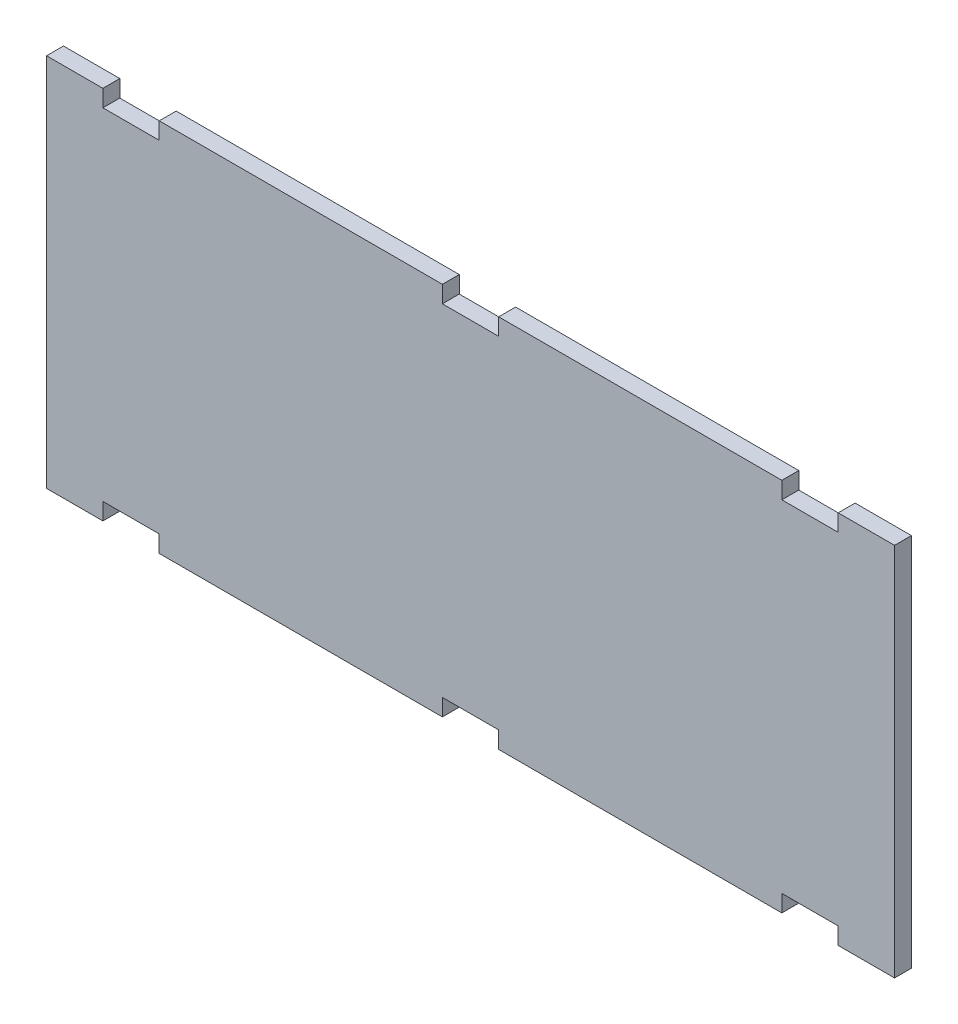
ISO-10303-21;
HEADER;
FILE_DESCRIPTION(('STEP AP214'),'2;1');
FILE_NAME('part.step','',(''),(''),'','','');
FILE_SCHEMA(('AUTOMOTIVE_DESIGN { 1 0 10303 214 1 1 1 1 }'));
ENDSEC;
DATA;
#1=APPLICATION_CONTEXT('core data for automotive mechanical design processes');
#2=APPLICATION_PROTOCOL_DEFINITION('international standard','automotive_design',2000,#1);
#3=PRODUCT_CONTEXT('',#1,'mechanical');
#4=PRODUCT('Part','Part','',(#3));
#5=PRODUCT_RELATED_PRODUCT_CATEGORY('part','',(#4));
#6=PRODUCT_DEFINITION_FORMATION('','',#4);
#7=PRODUCT_DEFINITION_CONTEXT('part definition',#1,'design');
#8=PRODUCT_DEFINITION('design','',#6,#7);
#9=PRODUCT_DEFINITION_SHAPE('','',#8);
#10=(LENGTH_UNIT() NAMED_UNIT(*) SI_UNIT(.MILLI.,.METRE.));
#11=(NAMED_UNIT(*) PLANE_ANGLE_UNIT() SI_UNIT($,.RADIAN.));
#12=(NAMED_UNIT(*) SI_UNIT($,.STERADIAN.) SOLID_ANGLE_UNIT());
#13=UNCERTAINTY_MEASURE_WITH_UNIT(LENGTH_MEASURE(1.E-05),#10,'distance_accuracy_value','');
#14=(GEOMETRIC_REPRESENTATION_CONTEXT(3) GLOBAL_UNCERTAINTY_ASSIGNED_CONTEXT((#13)) GLOBAL_UNIT_ASSIGNED_CONTEXT((#10,
#11,#12)) REPRESENTATION_CONTEXT('',''));
#15=CARTESIAN_POINT('',(0.,0.,0.));
#16=DIRECTION('',(0.,0.,1.));
#17=DIRECTION('',(1.,0.,0.));
#18=AXIS2_PLACEMENT_3D('',#15,#16,#17);
#19=CARTESIAN_POINT('',(0.,0.,6.));
#20=DIRECTION('',(0.,1.,0.));
#21=DIRECTION('',(0.,0.,1.));
#22=AXIS2_PLACEMENT_3D('',#19,#20,#21);
#23=PLANE('',#22);
#24=DIRECTION('',(1.,0.,0.));
#25=VECTOR('',#24,1.);
#26=CARTESIAN_POINT('',(0.,0.,0.));
#27=LINE('',#26,#25);
#28=CARTESIAN_POINT('',(-20.,0.,0.));
#29=VERTEX_POINT('',#28);
#30=CARTESIAN_POINT('',(0.,0.,0.));
#31=VERTEX_POINT('',#30);
#32=EDGE_CURVE('E249',#29,#31,#27,.T.);
#33=ORIENTED_EDGE('',*,*,#32,.T.);
#34=DIRECTION('',(0.,0.,-1.));
#35=VECTOR('',#34,1.);
#36=CARTESIAN_POINT('',(0.,0.,6.));
#37=LINE('',#36,#35);
#38=CARTESIAN_POINT('',(0.,0.,6.));
#39=VERTEX_POINT('',#38);
#40=EDGE_CURVE('E11',#39,#31,#37,.T.);
#41=ORIENTED_EDGE('',*,*,#40,.F.);
#42=DIRECTION('',(1.,0.,0.));
#43=VECTOR('',#42,1.);
#44=CARTESIAN_POINT('',(0.,0.,6.));
#45=LINE('',#44,#43);
#46=CARTESIAN_POINT('',(-20.,0.,6.));
#47=VERTEX_POINT('',#46);
#48=EDGE_CURVE('E303',#47,#39,#45,.T.);
#49=ORIENTED_EDGE('',*,*,#48,.F.);
#50=DIRECTION('',(0.,0.,-1.));
#51=VECTOR('',#50,1.);
#52=CARTESIAN_POINT('',(-20.,0.,6.));
#53=LINE('',#52,#51);
#54=EDGE_CURVE('E245',#47,#29,#53,.T.);
#55=ORIENTED_EDGE('',*,*,#54,.T.);
#56=EDGE_LOOP('',(#33,#41,#49,#55));
#57=FACE_BOUND('',#56,.T.);
#58=ADVANCED_FACE('F33',(#57),#23,.F.);
#59=CARTESIAN_POINT('',(0.,0.,6.));
#60=DIRECTION('',(-1.,0.,0.));
#61=DIRECTION('',(0.,0.,1.));
#62=AXIS2_PLACEMENT_3D('',#59,#60,#61);
#63=PLANE('',#62);
#64=DIRECTION('',(0.,1.,0.));
#65=VECTOR('',#64,1.);
#66=CARTESIAN_POINT('',(0.,0.,0.));
#67=LINE('',#66,#65);
#68=CARTESIAN_POINT('',(0.,133.,0.));
#69=VERTEX_POINT('',#68);
#70=EDGE_CURVE('E252',#31,#69,#67,.T.);
#71=ORIENTED_EDGE('',*,*,#70,.T.);
#72=DIRECTION('',(0.,0.,-1.));
#73=VECTOR('',#72,1.);
#74=CARTESIAN_POINT('',(0.,133.,6.));
#75=LINE('',#74,#73);
#76=CARTESIAN_POINT('',(0.,133.,6.));
#77=VERTEX_POINT('',#76);
#78=EDGE_CURVE('E41',#77,#69,#75,.T.);
#79=ORIENTED_EDGE('',*,*,#78,.F.);
#80=DIRECTION('',(0.,1.,0.));
#81=VECTOR('',#80,1.);
#82=CARTESIAN_POINT('',(0.,0.,6.));
#83=LINE('',#82,#81);
#84=EDGE_CURVE('E152',#39,#77,#83,.T.);
#85=ORIENTED_EDGE('',*,*,#84,.F.);
#86=ORIENTED_EDGE('',*,*,#40,.T.);
#87=EDGE_LOOP('',(#71,#79,#85,#86));
#88=FACE_BOUND('',#87,.T.);
#89=ADVANCED_FACE('F461',(#88),#63,.F.);
#90=CARTESIAN_POINT('',(0.,133.,6.));
#91=DIRECTION('',(0.,-1.,0.));
#92=DIRECTION('',(0.,0.,-1.));
#93=AXIS2_PLACEMENT_3D('',#90,#91,#92);
#94=PLANE('',#93);
#95=DIRECTION('',(-1.,0.,0.));
#96=VECTOR('',#95,1.);
#97=CARTESIAN_POINT('',(0.,133.,0.));
#98=LINE('',#97,#96);
#99=CARTESIAN_POINT('',(-20.,133.,0.));
#100=VERTEX_POINT('',#99);
#101=EDGE_CURVE('E254',#69,#100,#98,.T.);
#102=ORIENTED_EDGE('',*,*,#101,.T.);
#103=DIRECTION('',(0.,0.,-1.));
#104=VECTOR('',#103,1.);
#105=CARTESIAN_POINT('',(-20.,133.,6.));
#106=LINE('',#105,#104);
#107=CARTESIAN_POINT('',(-20.,133.,6.));
#108=VERTEX_POINT('',#107);
#109=EDGE_CURVE('E370',#108,#100,#106,.T.);
#110=ORIENTED_EDGE('',*,*,#109,.F.);
#111=DIRECTION('',(-1.,0.,0.));
#112=VECTOR('',#111,1.);
#113=CARTESIAN_POINT('',(0.,133.,6.));
#114=LINE('',#113,#112);
#115=EDGE_CURVE('E378',#77,#108,#114,.T.);
#116=ORIENTED_EDGE('',*,*,#115,.F.);
#117=ORIENTED_EDGE('',*,*,#78,.T.);
#118=EDGE_LOOP('',(#102,#110,#116,#117));
#119=FACE_BOUND('',#118,.T.);
#120=ADVANCED_FACE('F376',(#119),#94,.F.);
#121=CARTESIAN_POINT('',(-20.,133.,6.));
#122=DIRECTION('',(1.,0.,0.));
#123=DIRECTION('',(0.,0.,-1.));
#124=AXIS2_PLACEMENT_3D('',#121,#122,#123);
#125=PLANE('',#124);
#126=DIRECTION('',(0.,-1.,0.));
#127=VECTOR('',#126,1.);
#128=CARTESIAN_POINT('',(-20.,133.,0.));
#129=LINE('',#128,#127);
#130=CARTESIAN_POINT('',(-20.,127.,0.));
#131=VERTEX_POINT('',#130);
#132=EDGE_CURVE('E256',#100,#131,#129,.T.);
#133=ORIENTED_EDGE('',*,*,#132,.T.);
#134=DIRECTION('',(0.,0.,-1.));
#135=VECTOR('',#134,1.);
#136=CARTESIAN_POINT('',(-20.,127.,6.));
#137=LINE('',#136,#135);
#138=CARTESIAN_POINT('',(-20.,127.,6.));
#139=VERTEX_POINT('',#138);
#140=EDGE_CURVE('E367',#139,#131,#137,.T.);
#141=ORIENTED_EDGE('',*,*,#140,.F.);
#142=DIRECTION('',(0.,-1.,0.));
#143=VECTOR('',#142,1.);
#144=CARTESIAN_POINT('',(-20.,133.,6.));
#145=LINE('',#144,#143);
#146=EDGE_CURVE('E396',#108,#139,#145,.T.);
#147=ORIENTED_EDGE('',*,*,#146,.F.);
#148=ORIENTED_EDGE('',*,*,#109,.T.);
#149=EDGE_LOOP('',(#133,#141,#147,#148));
#150=FACE_BOUND('',#149,.T.);
#151=ADVANCED_FACE('F387',(#150),#125,.F.);
#152=CARTESIAN_POINT('',(-40.,127.,6.));
#153=DIRECTION('',(0.,-1.,0.));
#154=DIRECTION('',(0.,0.,-1.));
#155=AXIS2_PLACEMENT_3D('',#152,#153,#154);
#156=PLANE('',#155);
#157=DIRECTION('',(-1.,0.,0.));
#158=VECTOR('',#157,1.);
#159=CARTESIAN_POINT('',(-40.,127.,0.));
#160=LINE('',#159,#158);
#161=CARTESIAN_POINT('',(-40.,127.,0.));
#162=VERTEX_POINT('',#161);
#163=EDGE_CURVE('E258',#131,#162,#160,.T.);
#164=ORIENTED_EDGE('',*,*,#163,.T.);
#165=DIRECTION('',(0.,0.,-1.));
#166=VECTOR('',#165,1.);
#167=CARTESIAN_POINT('',(-40.,127.,6.));
#168=LINE('',#167,#166);
#169=CARTESIAN_POINT('',(-40.,127.,6.));
#170=VERTEX_POINT('',#169);
#171=EDGE_CURVE('E364',#170,#162,#168,.T.);
#172=ORIENTED_EDGE('',*,*,#171,.F.);
#173=DIRECTION('',(-1.,0.,0.));
#174=VECTOR('',#173,1.);
#175=CARTESIAN_POINT('',(-40.,127.,6.));
#176=LINE('',#175,#174);
#177=EDGE_CURVE('E393',#139,#170,#176,.T.);
#178=ORIENTED_EDGE('',*,*,#177,.F.);
#179=ORIENTED_EDGE('',*,*,#140,.T.);
#180=EDGE_LOOP('',(#164,#172,#178,#179));
#181=FACE_BOUND('',#180,.T.);
#182=ADVANCED_FACE('F391',(#181),#156,.F.);
#183=CARTESIAN_POINT('',(-40.,133.,6.));
#184=DIRECTION('',(-1.,0.,0.));
#185=DIRECTION('',(0.,0.,1.));
#186=AXIS2_PLACEMENT_3D('',#183,#184,#185);
#187=PLANE('',#186);
#188=DIRECTION('',(0.,1.,0.));
#189=VECTOR('',#188,1.);
#190=CARTESIAN_POINT('',(-40.,133.,0.));
#191=LINE('',#190,#189);
#192=CARTESIAN_POINT('',(-40.,133.,0.));
#193=VERTEX_POINT('',#192);
#194=EDGE_CURVE('E260',#162,#193,#191,.T.);
#195=ORIENTED_EDGE('',*,*,#194,.T.);
#196=DIRECTION('',(0.,0.,-1.));
#197=VECTOR('',#196,1.);
#198=CARTESIAN_POINT('',(-40.,133.,6.));
#199=LINE('',#198,#197);
#200=CARTESIAN_POINT('',(-40.,133.,6.));
#201=VERTEX_POINT('',#200);
#202=EDGE_CURVE('E361',#201,#193,#199,.T.);
#203=ORIENTED_EDGE('',*,*,#202,.F.);
#204=DIRECTION('',(0.,1.,0.));
#205=VECTOR('',#204,1.);
#206=CARTESIAN_POINT('',(-40.,133.,6.));
#207=LINE('',#206,#205);
#208=EDGE_CURVE('E395',#170,#201,#207,.T.);
#209=ORIENTED_EDGE('',*,*,#208,.F.);
#210=ORIENTED_EDGE('',*,*,#171,.T.);
#211=EDGE_LOOP('',(#195,#203,#209,#210));
#212=FACE_BOUND('',#211,.T.);
#213=ADVANCED_FACE('F474',(#212),#187,.F.);
#214=CARTESIAN_POINT('',(-40.,133.,6.));
#215=DIRECTION('',(0.,-1.,0.));
#216=DIRECTION('',(0.,0.,-1.));
#217=AXIS2_PLACEMENT_3D('',#214,#215,#216);
#218=PLANE('',#217);
#219=DIRECTION('',(-1.,0.,0.));
#220=VECTOR('',#219,1.);
#221=CARTESIAN_POINT('',(-40.,133.,0.));
#222=LINE('',#221,#220);
#223=CARTESIAN_POINT('',(-140.5,133.,0.));
#224=VERTEX_POINT('',#223);
#225=EDGE_CURVE('E262',#193,#224,#222,.T.);
#226=ORIENTED_EDGE('',*,*,#225,.T.);
#227=DIRECTION('',(0.,0.,-1.));
#228=VECTOR('',#227,1.);
#229=CARTESIAN_POINT('',(-140.5,133.,6.));
#230=LINE('',#229,#228);
#231=CARTESIAN_POINT('',(-140.5,133.,6.));
#232=VERTEX_POINT('',#231);
#233=EDGE_CURVE('E358',#232,#224,#230,.T.);
#234=ORIENTED_EDGE('',*,*,#233,.F.);
#235=DIRECTION('',(-1.,0.,0.));
#236=VECTOR('',#235,1.);
#237=CARTESIAN_POINT('',(-40.,133.,6.));
#238=LINE('',#237,#236);
#239=EDGE_CURVE('E398',#201,#232,#238,.T.);
#240=ORIENTED_EDGE('',*,*,#239,.F.);
#241=ORIENTED_EDGE('',*,*,#202,.T.);
#242=EDGE_LOOP('',(#226,#234,#240,#241));
#243=FACE_BOUND('',#242,.T.);
#244=ADVANCED_FACE('F477',(#243),#218,.F.);
#245=CARTESIAN_POINT('',(-140.5,133.,6.));
#246=DIRECTION('',(1.,0.,0.));
#247=DIRECTION('',(0.,0.,-1.));
#248=AXIS2_PLACEMENT_3D('',#245,#246,#247);
#249=PLANE('',#248);
#250=DIRECTION('',(0.,-1.,0.));
#251=VECTOR('',#250,1.);
#252=CARTESIAN_POINT('',(-140.5,133.,0.));
#253=LINE('',#252,#251);
#254=CARTESIAN_POINT('',(-140.5,127.,0.));
#255=VERTEX_POINT('',#254);
#256=EDGE_CURVE('E264',#224,#255,#253,.T.);
#257=ORIENTED_EDGE('',*,*,#256,.T.);
#258=DIRECTION('',(0.,0.,-1.));
#259=VECTOR('',#258,1.);
#260=CARTESIAN_POINT('',(-140.5,127.,6.));
#261=LINE('',#260,#259);
#262=CARTESIAN_POINT('',(-140.5,127.,6.));
#263=VERTEX_POINT('',#262);
#264=EDGE_CURVE('E355',#263,#255,#261,.T.);
#265=ORIENTED_EDGE('',*,*,#264,.F.);
#266=DIRECTION('',(0.,-1.,0.));
#267=VECTOR('',#266,1.);
#268=CARTESIAN_POINT('',(-140.5,133.,6.));
#269=LINE('',#268,#267);
#270=EDGE_CURVE('E404',#232,#263,#269,.T.);
#271=ORIENTED_EDGE('',*,*,#270,.F.);
#272=ORIENTED_EDGE('',*,*,#233,.T.);
#273=EDGE_LOOP('',(#257,#265,#271,#272));
#274=FACE_BOUND('',#273,.T.);
#275=ADVANCED_FACE('F481',(#274),#249,.F.);
#276=CARTESIAN_POINT('',(-160.5,127.,6.));
#277=DIRECTION('',(0.,-1.,0.));
#278=DIRECTION('',(0.,0.,-1.));
#279=AXIS2_PLACEMENT_3D('',#276,#277,#278);
#280=PLANE('',#279);
#281=DIRECTION('',(-1.,0.,0.));
#282=VECTOR('',#281,1.);
#283=CARTESIAN_POINT('',(-160.5,127.,0.));
#284=LINE('',#283,#282);
#285=CARTESIAN_POINT('',(-160.5,127.,0.));
#286=VERTEX_POINT('',#285);
#287=EDGE_CURVE('E266',#255,#286,#284,.T.);
#288=ORIENTED_EDGE('',*,*,#287,.T.);
#289=DIRECTION('',(0.,0.,-1.));
#290=VECTOR('',#289,1.);
#291=CARTESIAN_POINT('',(-160.5,127.,6.));
#292=LINE('',#291,#290);
#293=CARTESIAN_POINT('',(-160.5,127.,6.));
#294=VERTEX_POINT('',#293);
#295=EDGE_CURVE('E352',#294,#286,#292,.T.);
#296=ORIENTED_EDGE('',*,*,#295,.F.);
#297=DIRECTION('',(-1.,0.,0.));
#298=VECTOR('',#297,1.);
#299=CARTESIAN_POINT('',(-160.5,127.,6.));
#300=LINE('',#299,#298);
#301=EDGE_CURVE('E406',#263,#294,#300,.T.);
#302=ORIENTED_EDGE('',*,*,#301,.F.);
#303=ORIENTED_EDGE('',*,*,#264,.T.);
#304=EDGE_LOOP('',(#288,#296,#302,#303));
#305=FACE_BOUND('',#304,.T.);
#306=ADVANCED_FACE('F485',(#305),#280,.F.);
#307=CARTESIAN_POINT('',(-160.5,133.,6.));
#308=DIRECTION('',(-1.,0.,0.));
#309=DIRECTION('',(0.,0.,1.));
#310=AXIS2_PLACEMENT_3D('',#307,#308,#309);
#311=PLANE('',#310);
#312=DIRECTION('',(0.,1.,0.));
#313=VECTOR('',#312,1.);
#314=CARTESIAN_POINT('',(-160.5,133.,0.));
#315=LINE('',#314,#313);
#316=CARTESIAN_POINT('',(-160.5,133.,0.));
#317=VERTEX_POINT('',#316);
#318=EDGE_CURVE('E268',#286,#317,#315,.T.);
#319=ORIENTED_EDGE('',*,*,#318,.T.);
#320=DIRECTION('',(0.,0.,-1.));
#321=VECTOR('',#320,1.);
#322=CARTESIAN_POINT('',(-160.5,133.,6.));
#323=LINE('',#322,#321);
#324=CARTESIAN_POINT('',(-160.5,133.,6.));
#325=VERTEX_POINT('',#324);
#326=EDGE_CURVE('E349',#325,#317,#323,.T.);
#327=ORIENTED_EDGE('',*,*,#326,.F.);
#328=DIRECTION('',(0.,1.,0.));
#329=VECTOR('',#328,1.);
#330=CARTESIAN_POINT('',(-160.5,133.,6.));
#331=LINE('',#330,#329);
#332=EDGE_CURVE('E408',#294,#325,#331,.T.);
#333=ORIENTED_EDGE('',*,*,#332,.F.);
#334=ORIENTED_EDGE('',*,*,#295,.T.);
#335=EDGE_LOOP('',(#319,#327,#333,#334));
#336=FACE_BOUND('',#335,.T.);
#337=ADVANCED_FACE('F489',(#336),#311,.F.);
#338=CARTESIAN_POINT('',(-160.5,133.,6.));
#339=DIRECTION('',(0.,-1.,0.));
#340=DIRECTION('',(1.,0.,0.));
#341=AXIS2_PLACEMENT_3D('',#338,#339,#340);
#342=PLANE('',#341);
#343=DIRECTION('',(-1.,0.,0.));
#344=VECTOR('',#343,1.);
#345=CARTESIAN_POINT('',(-160.5,133.,0.));
#346=LINE('',#345,#344);
#347=CARTESIAN_POINT('',(-261.,133.,0.));
#348=VERTEX_POINT('',#347);
#349=EDGE_CURVE('E270',#317,#348,#346,.T.);
#350=ORIENTED_EDGE('',*,*,#349,.T.);
#351=DIRECTION('',(0.,0.,-1.));
#352=VECTOR('',#351,1.);
#353=CARTESIAN_POINT('',(-261.,133.,6.));
#354=LINE('',#353,#352);
#355=CARTESIAN_POINT('',(-261.,133.,6.));
#356=VERTEX_POINT('',#355);
#357=EDGE_CURVE('E346',#356,#348,#354,.T.);
#358=ORIENTED_EDGE('',*,*,#357,.F.);
#359=DIRECTION('',(-1.,0.,0.));
#360=VECTOR('',#359,1.);
#361=CARTESIAN_POINT('',(-160.5,133.,6.));
#362=LINE('',#361,#360);
#363=EDGE_CURVE('E410',#325,#356,#362,.T.);
#364=ORIENTED_EDGE('',*,*,#363,.F.);
#365=ORIENTED_EDGE('',*,*,#326,.T.);
#366=EDGE_LOOP('',(#350,#358,#364,#365));
#367=FACE_BOUND('',#366,.T.);
#368=ADVANCED_FACE('F493',(#367),#342,.F.);
#369=CARTESIAN_POINT('',(-261.,133.,6.));
#370=DIRECTION('',(1.,0.,0.));
#371=DIRECTION('',(0.,0.,-1.));
#372=AXIS2_PLACEMENT_3D('',#369,#370,#371);
#373=PLANE('',#372);
#374=DIRECTION('',(0.,-1.,0.));
#375=VECTOR('',#374,1.);
#376=CARTESIAN_POINT('',(-261.,133.,0.));
#377=LINE('',#376,#375);
#378=CARTESIAN_POINT('',(-261.,127.,0.));
#379=VERTEX_POINT('',#378);
#380=EDGE_CURVE('E272',#348,#379,#377,.T.);
#381=ORIENTED_EDGE('',*,*,#380,.T.);
#382=DIRECTION('',(0.,0.,-1.));
#383=VECTOR('',#382,1.);
#384=CARTESIAN_POINT('',(-261.,127.,6.));
#385=LINE('',#384,#383);
#386=CARTESIAN_POINT('',(-261.,127.,6.));
#387=VERTEX_POINT('',#386);
#388=EDGE_CURVE('E343',#387,#379,#385,.T.);
#389=ORIENTED_EDGE('',*,*,#388,.F.);
#390=DIRECTION('',(0.,-1.,0.));
#391=VECTOR('',#390,1.);
#392=CARTESIAN_POINT('',(-261.,133.,6.));
#393=LINE('',#392,#391);
#394=EDGE_CURVE('E412',#356,#387,#393,.T.);
#395=ORIENTED_EDGE('',*,*,#394,.F.);
#396=ORIENTED_EDGE('',*,*,#357,.T.);
#397=EDGE_LOOP('',(#381,#389,#395,#396));
#398=FACE_BOUND('',#397,.T.);
#399=ADVANCED_FACE('F497',(#398),#373,.F.);
#400=CARTESIAN_POINT('',(-281.,127.,6.));
#401=DIRECTION('',(0.,-1.,0.));
#402=DIRECTION('',(0.,0.,-1.));
#403=AXIS2_PLACEMENT_3D('',#400,#401,#402);
#404=PLANE('',#403);
#405=DIRECTION('',(-1.,0.,0.));
#406=VECTOR('',#405,1.);
#407=CARTESIAN_POINT('',(-281.,127.,0.));
#408=LINE('',#407,#406);
#409=CARTESIAN_POINT('',(-281.,127.,0.));
#410=VERTEX_POINT('',#409);
#411=EDGE_CURVE('E274',#379,#410,#408,.T.);
#412=ORIENTED_EDGE('',*,*,#411,.T.);
#413=DIRECTION('',(0.,0.,-1.));
#414=VECTOR('',#413,1.);
#415=CARTESIAN_POINT('',(-281.,127.,6.));
#416=LINE('',#415,#414);
#417=CARTESIAN_POINT('',(-281.,127.,6.));
#418=VERTEX_POINT('',#417);
#419=EDGE_CURVE('E340',#418,#410,#416,.T.);
#420=ORIENTED_EDGE('',*,*,#419,.F.);
#421=DIRECTION('',(-1.,0.,0.));
#422=VECTOR('',#421,1.);
#423=CARTESIAN_POINT('',(-281.,127.,6.));
#424=LINE('',#423,#422);
#425=EDGE_CURVE('E414',#387,#418,#424,.T.);
#426=ORIENTED_EDGE('',*,*,#425,.F.);
#427=ORIENTED_EDGE('',*,*,#388,.T.);
#428=EDGE_LOOP('',(#412,#420,#426,#427));
#429=FACE_BOUND('',#428,.T.);
#430=ADVANCED_FACE('F501',(#429),#404,.F.);
#431=CARTESIAN_POINT('',(-281.,133.,6.));
#432=DIRECTION('',(-1.,0.,0.));
#433=DIRECTION('',(0.,0.,1.));
#434=AXIS2_PLACEMENT_3D('',#431,#432,#433);
#435=PLANE('',#434);
#436=DIRECTION('',(0.,1.,0.));
#437=VECTOR('',#436,1.);
#438=CARTESIAN_POINT('',(-281.,133.,0.));
#439=LINE('',#438,#437);
#440=CARTESIAN_POINT('',(-281.,133.,0.));
#441=VERTEX_POINT('',#440);
#442=EDGE_CURVE('E276',#410,#441,#439,.T.);
#443=ORIENTED_EDGE('',*,*,#442,.T.);
#444=DIRECTION('',(0.,0.,-1.));
#445=VECTOR('',#444,1.);
#446=CARTESIAN_POINT('',(-281.,133.,6.));
#447=LINE('',#446,#445);
#448=CARTESIAN_POINT('',(-281.,133.,6.));
#449=VERTEX_POINT('',#448);
#450=EDGE_CURVE('E337',#449,#441,#447,.T.);
#451=ORIENTED_EDGE('',*,*,#450,.F.);
#452=DIRECTION('',(0.,1.,0.));
#453=VECTOR('',#452,1.);
#454=CARTESIAN_POINT('',(-281.,133.,6.));
#455=LINE('',#454,#453);
#456=EDGE_CURVE('E416',#418,#449,#455,.T.);
#457=ORIENTED_EDGE('',*,*,#456,.F.);
#458=ORIENTED_EDGE('',*,*,#419,.T.);
#459=EDGE_LOOP('',(#443,#451,#457,#458));
#460=FACE_BOUND('',#459,.T.);
#461=ADVANCED_FACE('F505',(#460),#435,.F.);
#462=CARTESIAN_POINT('',(-281.,133.,6.));
#463=DIRECTION('',(0.,-1.,0.));
#464=DIRECTION('',(1.,0.,0.));
#465=AXIS2_PLACEMENT_3D('',#462,#463,#464);
#466=PLANE('',#465);
#467=DIRECTION('',(-1.,0.,0.));
#468=VECTOR('',#467,1.);
#469=CARTESIAN_POINT('',(-281.,133.,0.));
#470=LINE('',#469,#468);
#471=CARTESIAN_POINT('',(-301.,133.,0.));
#472=VERTEX_POINT('',#471);
#473=EDGE_CURVE('E278',#441,#472,#470,.T.);
#474=ORIENTED_EDGE('',*,*,#473,.T.);
#475=DIRECTION('',(0.,0.,-1.));
#476=VECTOR('',#475,1.);
#477=CARTESIAN_POINT('',(-301.,133.,6.));
#478=LINE('',#477,#476);
#479=CARTESIAN_POINT('',(-301.,133.,6.));
#480=VERTEX_POINT('',#479);
#481=EDGE_CURVE('E334',#480,#472,#478,.T.);
#482=ORIENTED_EDGE('',*,*,#481,.F.);
#483=DIRECTION('',(-1.,0.,0.));
#484=VECTOR('',#483,1.);
#485=CARTESIAN_POINT('',(-281.,133.,6.));
#486=LINE('',#485,#484);
#487=EDGE_CURVE('E418',#449,#480,#486,.T.);
#488=ORIENTED_EDGE('',*,*,#487,.F.);
#489=ORIENTED_EDGE('',*,*,#450,.T.);
#490=EDGE_LOOP('',(#474,#482,#488,#489));
#491=FACE_BOUND('',#490,.T.);
#492=ADVANCED_FACE('F509',(#491),#466,.F.);
#493=CARTESIAN_POINT('',(-301.,0.,6.));
#494=DIRECTION('',(1.,0.,0.));
#495=DIRECTION('',(0.,0.,-1.));
#496=AXIS2_PLACEMENT_3D('',#493,#494,#495);
#497=PLANE('',#496);
#498=DIRECTION('',(0.,-1.,0.));
#499=VECTOR('',#498,1.);
#500=CARTESIAN_POINT('',(-301.,0.,0.));
#501=LINE('',#500,#499);
#502=CARTESIAN_POINT('',(-301.,0.,0.));
#503=VERTEX_POINT('',#502);
#504=EDGE_CURVE('E280',#472,#503,#501,.T.);
#505=ORIENTED_EDGE('',*,*,#504,.T.);
#506=DIRECTION('',(0.,0.,-1.));
#507=VECTOR('',#506,1.);
#508=CARTESIAN_POINT('',(-301.,0.,6.));
#509=LINE('',#508,#507);
#510=CARTESIAN_POINT('',(-301.,0.,6.));
#511=VERTEX_POINT('',#510);
#512=EDGE_CURVE('E331',#511,#503,#509,.T.);
#513=ORIENTED_EDGE('',*,*,#512,.F.);
#514=DIRECTION('',(0.,-1.,0.));
#515=VECTOR('',#514,1.);
#516=CARTESIAN_POINT('',(-301.,0.,6.));
#517=LINE('',#516,#515);
#518=EDGE_CURVE('E420',#480,#511,#517,.T.);
#519=ORIENTED_EDGE('',*,*,#518,.F.);
#520=ORIENTED_EDGE('',*,*,#481,.T.);
#521=EDGE_LOOP('',(#505,#513,#519,#520));
#522=FACE_BOUND('',#521,.T.);
#523=ADVANCED_FACE('F513',(#522),#497,.F.);
#524=CARTESIAN_POINT('',(-281.,0.,6.));
#525=DIRECTION('',(0.,1.,0.));
#526=DIRECTION('',(-1.,0.,0.));
#527=AXIS2_PLACEMENT_3D('',#524,#525,#526);
#528=PLANE('',#527);
#529=DIRECTION('',(1.,0.,0.));
#530=VECTOR('',#529,1.);
#531=CARTESIAN_POINT('',(-281.,0.,0.));
#532=LINE('',#531,#530);
#533=CARTESIAN_POINT('',(-281.,0.,0.));
#534=VERTEX_POINT('',#533);
#535=EDGE_CURVE('E282',#503,#534,#532,.T.);
#536=ORIENTED_EDGE('',*,*,#535,.T.);
#537=DIRECTION('',(0.,0.,-1.));
#538=VECTOR('',#537,1.);
#539=CARTESIAN_POINT('',(-281.,0.,6.));
#540=LINE('',#539,#538);
#541=CARTESIAN_POINT('',(-281.,0.,6.));
#542=VERTEX_POINT('',#541);
#543=EDGE_CURVE('E328',#542,#534,#540,.T.);
#544=ORIENTED_EDGE('',*,*,#543,.F.);
#545=DIRECTION('',(1.,0.,0.));
#546=VECTOR('',#545,1.);
#547=CARTESIAN_POINT('',(-281.,0.,6.));
#548=LINE('',#547,#546);
#549=EDGE_CURVE('E422',#511,#542,#548,.T.);
#550=ORIENTED_EDGE('',*,*,#549,.F.);
#551=ORIENTED_EDGE('',*,*,#512,.T.);
#552=EDGE_LOOP('',(#536,#544,#550,#551));
#553=FACE_BOUND('',#552,.T.);
#554=ADVANCED_FACE('F517',(#553),#528,.F.);
#555=CARTESIAN_POINT('',(-281.,0.,6.));
#556=DIRECTION('',(-1.,0.,0.));
#557=DIRECTION('',(0.,0.,1.));
#558=AXIS2_PLACEMENT_3D('',#555,#556,#557);
#559=PLANE('',#558);
#560=DIRECTION('',(0.,1.,0.));
#561=VECTOR('',#560,1.);
#562=CARTESIAN_POINT('',(-281.,0.,0.));
#563=LINE('',#562,#561);
#564=CARTESIAN_POINT('',(-281.,5.99999999999996,0.));
#565=VERTEX_POINT('',#564);
#566=EDGE_CURVE('E284',#534,#565,#563,.T.);
#567=ORIENTED_EDGE('',*,*,#566,.T.);
#568=DIRECTION('',(0.,0.,-1.));
#569=VECTOR('',#568,1.);
#570=CARTESIAN_POINT('',(-281.,5.99999999999996,6.));
#571=LINE('',#570,#569);
#572=CARTESIAN_POINT('',(-281.,5.99999999999996,6.));
#573=VERTEX_POINT('',#572);
#574=EDGE_CURVE('E325',#573,#565,#571,.T.);
#575=ORIENTED_EDGE('',*,*,#574,.F.);
#576=DIRECTION('',(0.,1.,0.));
#577=VECTOR('',#576,1.);
#578=CARTESIAN_POINT('',(-281.,0.,6.));
#579=LINE('',#578,#577);
#580=EDGE_CURVE('E424',#542,#573,#579,.T.);
#581=ORIENTED_EDGE('',*,*,#580,.F.);
#582=ORIENTED_EDGE('',*,*,#543,.T.);
#583=EDGE_LOOP('',(#567,#575,#581,#582));
#584=FACE_BOUND('',#583,.T.);
#585=ADVANCED_FACE('F521',(#584),#559,.F.);
#586=CARTESIAN_POINT('',(-281.,5.99999999999996,6.));
#587=DIRECTION('',(0.,1.,0.));
#588=DIRECTION('',(-1.,0.,0.));
#589=AXIS2_PLACEMENT_3D('',#586,#587,#588);
#590=PLANE('',#589);
#591=DIRECTION('',(1.,0.,0.));
#592=VECTOR('',#591,1.);
#593=CARTESIAN_POINT('',(-281.,5.99999999999996,0.));
#594=LINE('',#593,#592);
#595=CARTESIAN_POINT('',(-261.,5.99999999999998,0.));
#596=VERTEX_POINT('',#595);
#597=EDGE_CURVE('E286',#565,#596,#594,.T.);
#598=ORIENTED_EDGE('',*,*,#597,.T.);
#599=DIRECTION('',(0.,0.,-1.));
#600=VECTOR('',#599,1.);
#601=CARTESIAN_POINT('',(-261.,5.99999999999998,6.));
#602=LINE('',#601,#600);
#603=CARTESIAN_POINT('',(-261.,5.99999999999998,6.));
#604=VERTEX_POINT('',#603);
#605=EDGE_CURVE('E322',#604,#596,#602,.T.);
#606=ORIENTED_EDGE('',*,*,#605,.F.);
#607=DIRECTION('',(1.,0.,0.));
#608=VECTOR('',#607,1.);
#609=CARTESIAN_POINT('',(-281.,5.99999999999996,6.));
#610=LINE('',#609,#608);
#611=EDGE_CURVE('E426',#573,#604,#610,.T.);
#612=ORIENTED_EDGE('',*,*,#611,.F.);
#613=ORIENTED_EDGE('',*,*,#574,.T.);
#614=EDGE_LOOP('',(#598,#606,#612,#613));
#615=FACE_BOUND('',#614,.T.);
#616=ADVANCED_FACE('F525',(#615),#590,.F.);
#617=CARTESIAN_POINT('',(-261.,0.,6.));
#618=DIRECTION('',(1.,0.,0.));
#619=DIRECTION('',(0.,0.,-1.));
#620=AXIS2_PLACEMENT_3D('',#617,#618,#619);
#621=PLANE('',#620);
#622=DIRECTION('',(0.,-1.,0.));
#623=VECTOR('',#622,1.);
#624=CARTESIAN_POINT('',(-261.,0.,0.));
#625=LINE('',#624,#623);
#626=CARTESIAN_POINT('',(-261.,0.,0.));
#627=VERTEX_POINT('',#626);
#628=EDGE_CURVE('E288',#596,#627,#625,.T.);
#629=ORIENTED_EDGE('',*,*,#628,.T.);
#630=DIRECTION('',(0.,0.,-1.));
#631=VECTOR('',#630,1.);
#632=CARTESIAN_POINT('',(-261.,0.,6.));
#633=LINE('',#632,#631);
#634=CARTESIAN_POINT('',(-261.,0.,6.));
#635=VERTEX_POINT('',#634);
#636=EDGE_CURVE('E319',#635,#627,#633,.T.);
#637=ORIENTED_EDGE('',*,*,#636,.F.);
#638=DIRECTION('',(0.,-1.,0.));
#639=VECTOR('',#638,1.);
#640=CARTESIAN_POINT('',(-261.,0.,6.));
#641=LINE('',#640,#639);
#642=EDGE_CURVE('E428',#604,#635,#641,.T.);
#643=ORIENTED_EDGE('',*,*,#642,.F.);
#644=ORIENTED_EDGE('',*,*,#605,.T.);
#645=EDGE_LOOP('',(#629,#637,#643,#644));
#646=FACE_BOUND('',#645,.T.);
#647=ADVANCED_FACE('F529',(#646),#621,.F.);
#648=CARTESIAN_POINT('',(-160.5,0.,6.));
#649=DIRECTION('',(0.,1.,0.));
#650=DIRECTION('',(-1.,0.,0.));
#651=AXIS2_PLACEMENT_3D('',#648,#649,#650);
#652=PLANE('',#651);
#653=DIRECTION('',(1.,0.,0.));
#654=VECTOR('',#653,1.);
#655=CARTESIAN_POINT('',(-160.5,0.,0.));
#656=LINE('',#655,#654);
#657=CARTESIAN_POINT('',(-160.5,0.,0.));
#658=VERTEX_POINT('',#657);
#659=EDGE_CURVE('E290',#627,#658,#656,.T.);
#660=ORIENTED_EDGE('',*,*,#659,.T.);
#661=DIRECTION('',(0.,0.,-1.));
#662=VECTOR('',#661,1.);
#663=CARTESIAN_POINT('',(-160.5,0.,6.));
#664=LINE('',#663,#662);
#665=CARTESIAN_POINT('',(-160.5,0.,6.));
#666=VERTEX_POINT('',#665);
#667=EDGE_CURVE('E316',#666,#658,#664,.T.);
#668=ORIENTED_EDGE('',*,*,#667,.F.);
#669=DIRECTION('',(1.,0.,0.));
#670=VECTOR('',#669,1.);
#671=CARTESIAN_POINT('',(-160.5,0.,6.));
#672=LINE('',#671,#670);
#673=EDGE_CURVE('E430',#635,#666,#672,.T.);
#674=ORIENTED_EDGE('',*,*,#673,.F.);
#675=ORIENTED_EDGE('',*,*,#636,.T.);
#676=EDGE_LOOP('',(#660,#668,#674,#675));
#677=FACE_BOUND('',#676,.T.);
#678=ADVANCED_FACE('F533',(#677),#652,.F.);
#679=CARTESIAN_POINT('',(-160.5,0.,6.));
#680=DIRECTION('',(-1.,0.,0.));
#681=DIRECTION('',(0.,0.,1.));
#682=AXIS2_PLACEMENT_3D('',#679,#680,#681);
#683=PLANE('',#682);
#684=DIRECTION('',(0.,1.,0.));
#685=VECTOR('',#684,1.);
#686=CARTESIAN_POINT('',(-160.5,0.,0.));
#687=LINE('',#686,#685);
#688=CARTESIAN_POINT('',(-160.5,6.0000000000001,0.));
#689=VERTEX_POINT('',#688);
#690=EDGE_CURVE('E292',#658,#689,#687,.T.);
#691=ORIENTED_EDGE('',*,*,#690,.T.);
#692=DIRECTION('',(0.,0.,-1.));
#693=VECTOR('',#692,1.);
#694=CARTESIAN_POINT('',(-160.5,6.0000000000001,6.));
#695=LINE('',#694,#693);
#696=CARTESIAN_POINT('',(-160.5,6.0000000000001,6.));
#697=VERTEX_POINT('',#696);
#698=EDGE_CURVE('E313',#697,#689,#695,.T.);
#699=ORIENTED_EDGE('',*,*,#698,.F.);
#700=DIRECTION('',(0.,1.,0.));
#701=VECTOR('',#700,1.);
#702=CARTESIAN_POINT('',(-160.5,0.,6.));
#703=LINE('',#702,#701);
#704=EDGE_CURVE('E432',#666,#697,#703,.T.);
#705=ORIENTED_EDGE('',*,*,#704,.F.);
#706=ORIENTED_EDGE('',*,*,#667,.T.);
#707=EDGE_LOOP('',(#691,#699,#705,#706));
#708=FACE_BOUND('',#707,.T.);
#709=ADVANCED_FACE('F537',(#708),#683,.F.);
#710=CARTESIAN_POINT('',(-160.5,6.0000000000001,6.));
#711=DIRECTION('',(0.,1.,0.));
#712=DIRECTION('',(-1.,0.,0.));
#713=AXIS2_PLACEMENT_3D('',#710,#711,#712);
#714=PLANE('',#713);
#715=DIRECTION('',(1.,0.,0.));
#716=VECTOR('',#715,1.);
#717=CARTESIAN_POINT('',(-160.5,6.0000000000001,0.));
#718=LINE('',#717,#716);
#719=CARTESIAN_POINT('',(-140.5,6.00000000000009,0.));
#720=VERTEX_POINT('',#719);
#721=EDGE_CURVE('E294',#689,#720,#718,.T.);
#722=ORIENTED_EDGE('',*,*,#721,.T.);
#723=DIRECTION('',(0.,0.,-1.));
#724=VECTOR('',#723,1.);
#725=CARTESIAN_POINT('',(-140.5,6.00000000000009,6.));
#726=LINE('',#725,#724);
#727=CARTESIAN_POINT('',(-140.5,6.00000000000009,6.));
#728=VERTEX_POINT('',#727);
#729=EDGE_CURVE('E310',#728,#720,#726,.T.);
#730=ORIENTED_EDGE('',*,*,#729,.F.);
#731=DIRECTION('',(1.,0.,0.));
#732=VECTOR('',#731,1.);
#733=CARTESIAN_POINT('',(-160.5,6.0000000000001,6.));
#734=LINE('',#733,#732);
#735=EDGE_CURVE('E434',#697,#728,#734,.T.);
#736=ORIENTED_EDGE('',*,*,#735,.F.);
#737=ORIENTED_EDGE('',*,*,#698,.T.);
#738=EDGE_LOOP('',(#722,#730,#736,#737));
#739=FACE_BOUND('',#738,.T.);
#740=ADVANCED_FACE('F541',(#739),#714,.F.);
#741=CARTESIAN_POINT('',(-140.5,0.,6.));
#742=DIRECTION('',(1.,0.,0.));
#743=DIRECTION('',(0.,0.,-1.));
#744=AXIS2_PLACEMENT_3D('',#741,#742,#743);
#745=PLANE('',#744);
#746=DIRECTION('',(0.,-1.,0.));
#747=VECTOR('',#746,1.);
#748=CARTESIAN_POINT('',(-140.5,0.,0.));
#749=LINE('',#748,#747);
#750=CARTESIAN_POINT('',(-140.5,0.,0.));
#751=VERTEX_POINT('',#750);
#752=EDGE_CURVE('E296',#720,#751,#749,.T.);
#753=ORIENTED_EDGE('',*,*,#752,.T.);
#754=DIRECTION('',(0.,0.,-1.));
#755=VECTOR('',#754,1.);
#756=CARTESIAN_POINT('',(-140.5,0.,6.));
#757=LINE('',#756,#755);
#758=CARTESIAN_POINT('',(-140.5,0.,6.));
#759=VERTEX_POINT('',#758);
#760=EDGE_CURVE('E307',#759,#751,#757,.T.);
#761=ORIENTED_EDGE('',*,*,#760,.F.);
#762=DIRECTION('',(0.,-1.,0.));
#763=VECTOR('',#762,1.);
#764=CARTESIAN_POINT('',(-140.5,0.,6.));
#765=LINE('',#764,#763);
#766=EDGE_CURVE('E436',#728,#759,#765,.T.);
#767=ORIENTED_EDGE('',*,*,#766,.F.);
#768=ORIENTED_EDGE('',*,*,#729,.T.);
#769=EDGE_LOOP('',(#753,#761,#767,#768));
#770=FACE_BOUND('',#769,.T.);
#771=ADVANCED_FACE('F442',(#770),#745,.F.);
#772=CARTESIAN_POINT('',(-40.,0.,6.));
#773=DIRECTION('',(0.,1.,0.));
#774=DIRECTION('',(-1.,0.,0.));
#775=AXIS2_PLACEMENT_3D('',#772,#773,#774);
#776=PLANE('',#775);
#777=DIRECTION('',(1.,0.,0.));
#778=VECTOR('',#777,1.);
#779=CARTESIAN_POINT('',(-40.,0.,0.));
#780=LINE('',#779,#778);
#781=CARTESIAN_POINT('',(-40.,0.,0.));
#782=VERTEX_POINT('',#781);
#783=EDGE_CURVE('E298',#751,#782,#780,.T.);
#784=ORIENTED_EDGE('',*,*,#783,.T.);
#785=DIRECTION('',(0.,0.,-1.));
#786=VECTOR('',#785,1.);
#787=CARTESIAN_POINT('',(-40.,0.,6.));
#788=LINE('',#787,#786);
#789=CARTESIAN_POINT('',(-40.,0.,6.));
#790=VERTEX_POINT('',#789);
#791=EDGE_CURVE('E240',#790,#782,#788,.T.);
#792=ORIENTED_EDGE('',*,*,#791,.F.);
#793=DIRECTION('',(1.,0.,0.));
#794=VECTOR('',#793,1.);
#795=CARTESIAN_POINT('',(-40.,0.,6.));
#796=LINE('',#795,#794);
#797=EDGE_CURVE('E231',#759,#790,#796,.T.);
#798=ORIENTED_EDGE('',*,*,#797,.F.);
#799=ORIENTED_EDGE('',*,*,#760,.T.);
#800=EDGE_LOOP('',(#784,#792,#798,#799));
#801=FACE_BOUND('',#800,.T.);
#802=ADVANCED_FACE('F446',(#801),#776,.F.);
#803=CARTESIAN_POINT('',(-40.,0.,6.));
#804=DIRECTION('',(-1.,0.,0.));
#805=DIRECTION('',(0.,0.,1.));
#806=AXIS2_PLACEMENT_3D('',#803,#804,#805);
#807=PLANE('',#806);
#808=DIRECTION('',(0.,1.,0.));
#809=VECTOR('',#808,1.);
#810=CARTESIAN_POINT('',(-40.,0.,0.));
#811=LINE('',#810,#809);
#812=CARTESIAN_POINT('',(-40.,6.00000000000005,0.));
#813=VERTEX_POINT('',#812);
#814=EDGE_CURVE('E239',#782,#813,#811,.T.);
#815=ORIENTED_EDGE('',*,*,#814,.T.);
#816=DIRECTION('',(0.,0.,-1.));
#817=VECTOR('',#816,1.);
#818=CARTESIAN_POINT('',(-40.,6.00000000000005,6.));
#819=LINE('',#818,#817);
#820=CARTESIAN_POINT('',(-40.,6.00000000000005,6.));
#821=VERTEX_POINT('',#820);
#822=EDGE_CURVE('E236',#821,#813,#819,.T.);
#823=ORIENTED_EDGE('',*,*,#822,.F.);
#824=DIRECTION('',(0.,1.,0.));
#825=VECTOR('',#824,1.);
#826=CARTESIAN_POINT('',(-40.,0.,6.));
#827=LINE('',#826,#825);
#828=EDGE_CURVE('E225',#790,#821,#827,.T.);
#829=ORIENTED_EDGE('',*,*,#828,.F.);
#830=ORIENTED_EDGE('',*,*,#791,.T.);
#831=EDGE_LOOP('',(#815,#823,#829,#830));
#832=FACE_BOUND('',#831,.T.);
#833=ADVANCED_FACE('F237',(#832),#807,.F.);
#834=CARTESIAN_POINT('',(-40.,6.00000000000005,6.));
#835=DIRECTION('',(0.,1.,0.));
#836=DIRECTION('',(0.,0.,1.));
#837=AXIS2_PLACEMENT_3D('',#834,#835,#836);
#838=PLANE('',#837);
#839=DIRECTION('',(1.,0.,0.));
#840=VECTOR('',#839,1.);
#841=CARTESIAN_POINT('',(-40.,6.00000000000005,0.));
#842=LINE('',#841,#840);
#843=CARTESIAN_POINT('',(-20.,6.00000000000005,0.));
#844=VERTEX_POINT('',#843);
#845=EDGE_CURVE('E138',#813,#844,#842,.T.);
#846=ORIENTED_EDGE('',*,*,#845,.T.);
#847=DIRECTION('',(0.,0.,-1.));
#848=VECTOR('',#847,1.);
#849=CARTESIAN_POINT('',(-20.,6.00000000000005,6.));
#850=LINE('',#849,#848);
#851=CARTESIAN_POINT('',(-20.,6.00000000000005,6.));
#852=VERTEX_POINT('',#851);
#853=EDGE_CURVE('E241',#852,#844,#850,.T.);
#854=ORIENTED_EDGE('',*,*,#853,.F.);
#855=DIRECTION('',(1.,0.,0.));
#856=VECTOR('',#855,1.);
#857=CARTESIAN_POINT('',(-40.,6.00000000000005,6.));
#858=LINE('',#857,#856);
#859=EDGE_CURVE('E229',#821,#852,#858,.T.);
#860=ORIENTED_EDGE('',*,*,#859,.F.);
#861=ORIENTED_EDGE('',*,*,#822,.T.);
#862=EDGE_LOOP('',(#846,#854,#860,#861));
#863=FACE_BOUND('',#862,.T.);
#864=ADVANCED_FACE('F243',(#863),#838,.F.);
#865=CARTESIAN_POINT('',(-20.,0.,6.));
#866=DIRECTION('',(1.,0.,0.));
#867=DIRECTION('',(0.,1.,0.));
#868=AXIS2_PLACEMENT_3D('',#865,#866,#867);
#869=PLANE('',#868);
#870=DIRECTION('',(0.,-1.,0.));
#871=VECTOR('',#870,1.);
#872=CARTESIAN_POINT('',(-20.,0.,0.));
#873=LINE('',#872,#871);
#874=EDGE_CURVE('E144',#844,#29,#873,.T.);
#875=ORIENTED_EDGE('',*,*,#874,.T.);
#876=ORIENTED_EDGE('',*,*,#54,.F.);
#877=DIRECTION('',(0.,-1.,0.));
#878=VECTOR('',#877,1.);
#879=CARTESIAN_POINT('',(-20.,0.,6.));
#880=LINE('',#879,#878);
#881=EDGE_CURVE('E49',#852,#47,#880,.T.);
#882=ORIENTED_EDGE('',*,*,#881,.F.);
#883=ORIENTED_EDGE('',*,*,#853,.T.);
#884=EDGE_LOOP('',(#875,#876,#882,#883));
#885=FACE_BOUND('',#884,.T.);
#886=ADVANCED_FACE('F450',(#885),#869,.F.);
#887=CARTESIAN_POINT('',(0.,0.,6.));
#888=DIRECTION('',(0.,0.,-1.));
#889=DIRECTION('',(-1.,0.,0.));
#890=AXIS2_PLACEMENT_3D('',#887,#888,#889);
#891=PLANE('',#890);
#892=ORIENTED_EDGE('',*,*,#48,.T.);
#893=ORIENTED_EDGE('',*,*,#84,.T.);
#894=ORIENTED_EDGE('',*,*,#115,.T.);
#895=ORIENTED_EDGE('',*,*,#146,.T.);
#896=ORIENTED_EDGE('',*,*,#177,.T.);
#897=ORIENTED_EDGE('',*,*,#208,.T.);
#898=ORIENTED_EDGE('',*,*,#239,.T.);
#899=ORIENTED_EDGE('',*,*,#270,.T.);
#900=ORIENTED_EDGE('',*,*,#301,.T.);
#901=ORIENTED_EDGE('',*,*,#332,.T.);
#902=ORIENTED_EDGE('',*,*,#363,.T.);
#903=ORIENTED_EDGE('',*,*,#394,.T.);
#904=ORIENTED_EDGE('',*,*,#425,.T.);
#905=ORIENTED_EDGE('',*,*,#456,.T.);
#906=ORIENTED_EDGE('',*,*,#487,.T.);
#907=ORIENTED_EDGE('',*,*,#518,.T.);
#908=ORIENTED_EDGE('',*,*,#549,.T.);
#909=ORIENTED_EDGE('',*,*,#580,.T.);
#910=ORIENTED_EDGE('',*,*,#611,.T.);
#911=ORIENTED_EDGE('',*,*,#642,.T.);
#912=ORIENTED_EDGE('',*,*,#673,.T.);
#913=ORIENTED_EDGE('',*,*,#704,.T.);
#914=ORIENTED_EDGE('',*,*,#735,.T.);
#915=ORIENTED_EDGE('',*,*,#766,.T.);
#916=ORIENTED_EDGE('',*,*,#797,.T.);
#917=ORIENTED_EDGE('',*,*,#828,.T.);
#918=ORIENTED_EDGE('',*,*,#859,.T.);
#919=ORIENTED_EDGE('',*,*,#881,.T.);
#920=EDGE_LOOP('',(#892,#893,#894,#895,#896,#897,#898,#899,#900,#901,#902,#903,#904,#905,#906,
#907,#908,#909,#910,#911,#912,#913,#914,#915,#916,#917,#918,#919));
#921=FACE_BOUND('',#920,.T.);
#922=ADVANCED_FACE('F227',(#921),#891,.F.);
#923=CARTESIAN_POINT('',(0.,0.,0.));
#924=DIRECTION('',(0.,0.,-1.));
#925=DIRECTION('',(-1.,0.,0.));
#926=AXIS2_PLACEMENT_3D('',#923,#924,#925);
#927=PLANE('',#926);
#928=ORIENTED_EDGE('',*,*,#32,.F.);
#929=ORIENTED_EDGE('',*,*,#874,.F.);
#930=ORIENTED_EDGE('',*,*,#845,.F.);
#931=ORIENTED_EDGE('',*,*,#814,.F.);
#932=ORIENTED_EDGE('',*,*,#783,.F.);
#933=ORIENTED_EDGE('',*,*,#752,.F.);
#934=ORIENTED_EDGE('',*,*,#721,.F.);
#935=ORIENTED_EDGE('',*,*,#690,.F.);
#936=ORIENTED_EDGE('',*,*,#659,.F.);
#937=ORIENTED_EDGE('',*,*,#628,.F.);
#938=ORIENTED_EDGE('',*,*,#597,.F.);
#939=ORIENTED_EDGE('',*,*,#566,.F.);
#940=ORIENTED_EDGE('',*,*,#535,.F.);
#941=ORIENTED_EDGE('',*,*,#504,.F.);
#942=ORIENTED_EDGE('',*,*,#473,.F.);
#943=ORIENTED_EDGE('',*,*,#442,.F.);
#944=ORIENTED_EDGE('',*,*,#411,.F.);
#945=ORIENTED_EDGE('',*,*,#380,.F.);
#946=ORIENTED_EDGE('',*,*,#349,.F.);
#947=ORIENTED_EDGE('',*,*,#318,.F.);
#948=ORIENTED_EDGE('',*,*,#287,.F.);
#949=ORIENTED_EDGE('',*,*,#256,.F.);
#950=ORIENTED_EDGE('',*,*,#225,.F.);
#951=ORIENTED_EDGE('',*,*,#194,.F.);
#952=ORIENTED_EDGE('',*,*,#163,.F.);
#953=ORIENTED_EDGE('',*,*,#132,.F.);
#954=ORIENTED_EDGE('',*,*,#101,.F.);
#955=ORIENTED_EDGE('',*,*,#70,.F.);
#956=EDGE_LOOP('',(#928,#929,#930,#931,#932,#933,#934,#935,#936,#937,#938,#939,#940,#941,#942,
#943,#944,#945,#946,#947,#948,#949,#950,#951,#952,#953,#954,#955));
#957=FACE_BOUND('',#956,.T.);
#958=ADVANCED_FACE('F382',(#957),#927,.T.);
#959=CLOSED_SHELL('',(#58,#89,#120,#151,#182,#213,#244,#275,#306,#337,#368,#399,#430,#461,#492,
#523,#554,#585,#616,#647,#678,#709,#740,#771,#802,#833,#864,#886,#922,#958));
#960=MANIFOLD_SOLID_BREP('B2',#959);
#961=ADVANCED_BREP_SHAPE_REPRESENTATION('',(#18,#960),#14);
#962=SHAPE_DEFINITION_REPRESENTATION(#9,#961);
ENDSEC;
END-ISO-10303-21;
